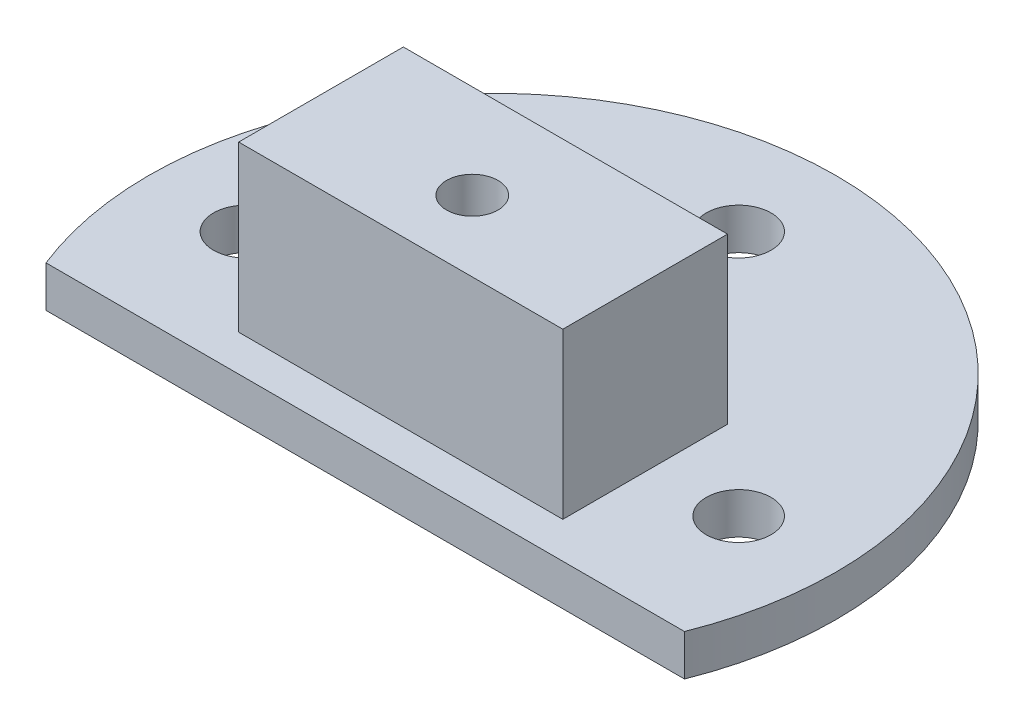
ISO-10303-21;
HEADER;
FILE_DESCRIPTION(('STEP AP214'),'2;1');
FILE_NAME('part.step','',(''),(''),'','','');
FILE_SCHEMA(('AUTOMOTIVE_DESIGN { 1 0 10303 214 1 1 1 1 }'));
ENDSEC;
DATA;
#1=APPLICATION_CONTEXT('core data for automotive mechanical design processes');
#2=APPLICATION_PROTOCOL_DEFINITION('international standard','automotive_design',2000,#1);
#3=PRODUCT_CONTEXT('',#1,'mechanical');
#4=PRODUCT('Part','Part','',(#3));
#5=PRODUCT_RELATED_PRODUCT_CATEGORY('part','',(#4));
#6=PRODUCT_DEFINITION_FORMATION('','',#4);
#7=PRODUCT_DEFINITION_CONTEXT('part definition',#1,'design');
#8=PRODUCT_DEFINITION('design','',#6,#7);
#9=PRODUCT_DEFINITION_SHAPE('','',#8);
#10=(LENGTH_UNIT() NAMED_UNIT(*) SI_UNIT(.MILLI.,.METRE.));
#11=(NAMED_UNIT(*) PLANE_ANGLE_UNIT() SI_UNIT($,.RADIAN.));
#12=(NAMED_UNIT(*) SI_UNIT($,.STERADIAN.) SOLID_ANGLE_UNIT());
#13=UNCERTAINTY_MEASURE_WITH_UNIT(LENGTH_MEASURE(1.E-05),#10,'distance_accuracy_value','');
#14=(GEOMETRIC_REPRESENTATION_CONTEXT(3) GLOBAL_UNCERTAINTY_ASSIGNED_CONTEXT((#13)) GLOBAL_UNIT_ASSIGNED_CONTEXT((#10,
#11,#12)) REPRESENTATION_CONTEXT('',''));
#15=CARTESIAN_POINT('',(0.,0.,0.));
#16=DIRECTION('',(0.,0.,1.));
#17=DIRECTION('',(1.,0.,0.));
#18=AXIS2_PLACEMENT_3D('',#15,#16,#17);
#19=CARTESIAN_POINT('',(0.,6.35,0.));
#20=DIRECTION('',(0.,1.,0.));
#21=DIRECTION('',(0.,0.,1.));
#22=AXIS2_PLACEMENT_3D('',#19,#20,#21);
#23=PLANE('',#22);
#24=DIRECTION('',(1.,0.,0.));
#25=VECTOR('',#24,1.);
#26=CARTESIAN_POINT('',(-25.1229174127317,6.35,-11.4));
#27=LINE('',#26,#25);
#28=CARTESIAN_POINT('',(-25.1229174127317,6.35,-11.4));
#29=VERTEX_POINT('',#28);
#30=CARTESIAN_POINT('',(24.8770825872683,6.35,-11.4));
#31=VERTEX_POINT('',#30);
#32=EDGE_CURVE('E122',#29,#31,#27,.T.);
#33=ORIENTED_EDGE('',*,*,#32,.T.);
#34=DIRECTION('',(0.,0.,-1.));
#35=VECTOR('',#34,1.);
#36=CARTESIAN_POINT('',(24.8770825872683,6.35,14.));
#37=LINE('',#36,#35);
#38=CARTESIAN_POINT('',(24.8770825872683,6.35,14.));
#39=VERTEX_POINT('',#38);
#40=EDGE_CURVE('E120',#39,#31,#37,.T.);
#41=ORIENTED_EDGE('',*,*,#40,.F.);
#42=DIRECTION('',(1.,0.,0.));
#43=VECTOR('',#42,1.);
#44=CARTESIAN_POINT('',(-25.1229174127317,6.35,14.));
#45=LINE('',#44,#43);
#46=CARTESIAN_POINT('',(-25.1229174127317,6.35,14.));
#47=VERTEX_POINT('',#46);
#48=EDGE_CURVE('E118',#47,#39,#45,.T.);
#49=ORIENTED_EDGE('',*,*,#48,.F.);
#50=DIRECTION('',(0.,0.,-1.));
#51=VECTOR('',#50,1.);
#52=CARTESIAN_POINT('',(-25.1229174127317,6.35,14.));
#53=LINE('',#52,#51);
#54=EDGE_CURVE('E114',#47,#29,#53,.T.);
#55=ORIENTED_EDGE('',*,*,#54,.T.);
#56=EDGE_LOOP('',(#33,#41,#49,#55));
#57=FACE_BOUND('',#56,.T.);
#58=CARTESIAN_POINT('',(38.,6.35,0.));
#59=DIRECTION('',(0.,1.,0.));
#60=DIRECTION('',(0.,0.,1.));
#61=AXIS2_PLACEMENT_3D('',#58,#59,#60);
#62=CIRCLE('',#61,5.);
#63=CARTESIAN_POINT('',(38.,6.35,5.));
#64=VERTEX_POINT('',#63);
#65=EDGE_CURVE('E90',#64,#64,#62,.T.);
#66=ORIENTED_EDGE('',*,*,#65,.F.);
#67=EDGE_LOOP('',(#66));
#68=FACE_BOUND('',#67,.T.);
#69=CARTESIAN_POINT('',(0.,6.35,0.));
#70=DIRECTION('',(0.,1.,0.));
#71=DIRECTION('',(0.,0.,1.));
#72=AXIS2_PLACEMENT_3D('',#69,#70,#71);
#73=CIRCLE('',#72,53.);
#74=CARTESIAN_POINT('',(49.2428543082641,6.35,19.5995229425382));
#75=VERTEX_POINT('',#74);
#76=CARTESIAN_POINT('',(-49.2428543082641,6.35,19.5995229425382));
#77=VERTEX_POINT('',#76);
#78=EDGE_CURVE('E75',#75,#77,#73,.T.);
#79=ORIENTED_EDGE('',*,*,#78,.T.);
#80=DIRECTION('',(1.,0.,0.));
#81=VECTOR('',#80,1.);
#82=CARTESIAN_POINT('',(-49.2428543082641,6.35,19.5995229425382));
#83=LINE('',#82,#81);
#84=EDGE_CURVE('E56',#77,#75,#83,.T.);
#85=ORIENTED_EDGE('',*,*,#84,.T.);
#86=EDGE_LOOP('',(#79,#85));
#87=FACE_BOUND('',#86,.T.);
#88=CARTESIAN_POINT('',(-38.,6.35,0.));
#89=DIRECTION('',(0.,1.,0.));
#90=DIRECTION('',(0.,0.,1.));
#91=AXIS2_PLACEMENT_3D('',#88,#89,#90);
#92=CIRCLE('',#91,5.);
#93=CARTESIAN_POINT('',(-38.,6.35,5.));
#94=VERTEX_POINT('',#93);
#95=EDGE_CURVE('E81',#94,#94,#92,.T.);
#96=ORIENTED_EDGE('',*,*,#95,.F.);
#97=EDGE_LOOP('',(#96));
#98=FACE_BOUND('',#97,.T.);
#99=CARTESIAN_POINT('',(0.,6.35,-38.));
#100=DIRECTION('',(0.,1.,0.));
#101=DIRECTION('',(0.,0.,1.));
#102=AXIS2_PLACEMENT_3D('',#99,#100,#101);
#103=CIRCLE('',#102,5.);
#104=CARTESIAN_POINT('',(0.,6.35,-33.));
#105=VERTEX_POINT('',#104);
#106=EDGE_CURVE('E95',#105,#105,#103,.T.);
#107=ORIENTED_EDGE('',*,*,#106,.F.);
#108=EDGE_LOOP('',(#107));
#109=FACE_BOUND('',#108,.T.);
#110=ADVANCED_FACE('F33',(#57,#68,#87,#98,#109),#23,.T.);
#111=CARTESIAN_POINT('',(0.,0.,0.));
#112=DIRECTION('',(0.,1.,0.));
#113=DIRECTION('',(0.,0.,1.));
#114=AXIS2_PLACEMENT_3D('',#111,#112,#113);
#115=PLANE('',#114);
#116=CARTESIAN_POINT('',(0.,0.,3.0894649210737));
#117=DIRECTION('',(0.,1.,0.));
#118=DIRECTION('',(0.,0.,1.));
#119=AXIS2_PLACEMENT_3D('',#116,#117,#118);
#120=CIRCLE('',#119,3.96875);
#121=CARTESIAN_POINT('',(0.,0.,7.0582149210737));
#122=VERTEX_POINT('',#121);
#123=EDGE_CURVE('E125',#122,#122,#120,.T.);
#124=ORIENTED_EDGE('',*,*,#123,.T.);
#125=EDGE_LOOP('',(#124));
#126=FACE_BOUND('',#125,.T.);
#127=CARTESIAN_POINT('',(0.,0.,0.));
#128=DIRECTION('',(0.,1.,0.));
#129=DIRECTION('',(0.,0.,1.));
#130=AXIS2_PLACEMENT_3D('',#127,#128,#129);
#131=CIRCLE('',#130,53.);
#132=CARTESIAN_POINT('',(49.2428543082641,0.,19.5995229425382));
#133=VERTEX_POINT('',#132);
#134=CARTESIAN_POINT('',(-49.2428543082641,0.,19.5995229425382));
#135=VERTEX_POINT('',#134);
#136=EDGE_CURVE('E76',#133,#135,#131,.T.);
#137=ORIENTED_EDGE('',*,*,#136,.F.);
#138=DIRECTION('',(1.,0.,0.));
#139=VECTOR('',#138,1.);
#140=CARTESIAN_POINT('',(-49.2428543082641,0.,19.5995229425382));
#141=LINE('',#140,#139);
#142=EDGE_CURVE('E67',#135,#133,#141,.T.);
#143=ORIENTED_EDGE('',*,*,#142,.F.);
#144=EDGE_LOOP('',(#137,#143));
#145=FACE_BOUND('',#144,.T.);
#146=CARTESIAN_POINT('',(-38.,0.,0.));
#147=DIRECTION('',(0.,1.,0.));
#148=DIRECTION('',(0.,0.,1.));
#149=AXIS2_PLACEMENT_3D('',#146,#147,#148);
#150=CIRCLE('',#149,5.);
#151=CARTESIAN_POINT('',(-38.,0.,5.));
#152=VERTEX_POINT('',#151);
#153=EDGE_CURVE('E84',#152,#152,#150,.T.);
#154=ORIENTED_EDGE('',*,*,#153,.T.);
#155=EDGE_LOOP('',(#154));
#156=FACE_BOUND('',#155,.T.);
#157=CARTESIAN_POINT('',(38.,0.,0.));
#158=DIRECTION('',(0.,1.,0.));
#159=DIRECTION('',(0.,0.,1.));
#160=AXIS2_PLACEMENT_3D('',#157,#158,#159);
#161=CIRCLE('',#160,5.);
#162=CARTESIAN_POINT('',(38.,0.,5.));
#163=VERTEX_POINT('',#162);
#164=EDGE_CURVE('E92',#163,#163,#161,.T.);
#165=ORIENTED_EDGE('',*,*,#164,.T.);
#166=EDGE_LOOP('',(#165));
#167=FACE_BOUND('',#166,.T.);
#168=CARTESIAN_POINT('',(0.,0.,-38.));
#169=DIRECTION('',(0.,1.,0.));
#170=DIRECTION('',(0.,0.,1.));
#171=AXIS2_PLACEMENT_3D('',#168,#169,#170);
#172=CIRCLE('',#171,5.);
#173=CARTESIAN_POINT('',(0.,0.,-33.));
#174=VERTEX_POINT('',#173);
#175=EDGE_CURVE('E98',#174,#174,#172,.T.);
#176=ORIENTED_EDGE('',*,*,#175,.T.);
#177=EDGE_LOOP('',(#176));
#178=FACE_BOUND('',#177,.T.);
#179=ADVANCED_FACE('F79',(#126,#145,#156,#167,#178),#115,.F.);
#180=CARTESIAN_POINT('',(0.,6.35,0.));
#181=DIRECTION('',(0.,-1.,0.));
#182=DIRECTION('',(0.,0.,-1.));
#183=AXIS2_PLACEMENT_3D('',#180,#181,#182);
#184=CYLINDRICAL_SURFACE('',#183,53.);
#185=ORIENTED_EDGE('',*,*,#136,.T.);
#186=DIRECTION('',(0.,-1.,0.));
#187=VECTOR('',#186,1.);
#188=CARTESIAN_POINT('',(-49.2428543082641,6.35,19.5995229425382));
#189=LINE('',#188,#187);
#190=EDGE_CURVE('E11',#77,#135,#189,.T.);
#191=ORIENTED_EDGE('',*,*,#190,.F.);
#192=ORIENTED_EDGE('',*,*,#78,.F.);
#193=DIRECTION('',(0.,-1.,0.));
#194=VECTOR('',#193,1.);
#195=CARTESIAN_POINT('',(49.2428543082641,6.35,19.5995229425382));
#196=LINE('',#195,#194);
#197=EDGE_CURVE('E41',#75,#133,#196,.T.);
#198=ORIENTED_EDGE('',*,*,#197,.T.);
#199=EDGE_LOOP('',(#185,#191,#192,#198));
#200=FACE_BOUND('',#199,.T.);
#201=ADVANCED_FACE('F35',(#200),#184,.T.);
#202=CARTESIAN_POINT('',(-49.2428543082641,6.35,19.5995229425382));
#203=DIRECTION('',(0.,0.,-1.));
#204=DIRECTION('',(-1.,0.,0.));
#205=AXIS2_PLACEMENT_3D('',#202,#203,#204);
#206=PLANE('',#205);
#207=ORIENTED_EDGE('',*,*,#142,.T.);
#208=ORIENTED_EDGE('',*,*,#197,.F.);
#209=ORIENTED_EDGE('',*,*,#84,.F.);
#210=ORIENTED_EDGE('',*,*,#190,.T.);
#211=EDGE_LOOP('',(#207,#208,#209,#210));
#212=FACE_BOUND('',#211,.T.);
#213=ADVANCED_FACE('F69',(#212),#206,.F.);
#214=CARTESIAN_POINT('',(-38.,6.35,0.));
#215=DIRECTION('',(0.,-1.,0.));
#216=DIRECTION('',(0.,0.,-1.));
#217=AXIS2_PLACEMENT_3D('',#214,#215,#216);
#218=CYLINDRICAL_SURFACE('',#217,5.);
#219=ORIENTED_EDGE('',*,*,#95,.T.);
#220=EDGE_LOOP('',(#219));
#221=FACE_BOUND('',#220,.T.);
#222=ORIENTED_EDGE('',*,*,#153,.F.);
#223=EDGE_LOOP('',(#222));
#224=FACE_BOUND('',#223,.T.);
#225=ADVANCED_FACE('F206',(#221,#224),#218,.F.);
#226=CARTESIAN_POINT('',(38.,6.35,0.));
#227=DIRECTION('',(0.,-1.,0.));
#228=DIRECTION('',(0.,0.,-1.));
#229=AXIS2_PLACEMENT_3D('',#226,#227,#228);
#230=CYLINDRICAL_SURFACE('',#229,5.);
#231=ORIENTED_EDGE('',*,*,#65,.T.);
#232=EDGE_LOOP('',(#231));
#233=FACE_BOUND('',#232,.T.);
#234=ORIENTED_EDGE('',*,*,#164,.F.);
#235=EDGE_LOOP('',(#234));
#236=FACE_BOUND('',#235,.T.);
#237=ADVANCED_FACE('F195',(#233,#236),#230,.F.);
#238=CARTESIAN_POINT('',(0.,6.35,-38.));
#239=DIRECTION('',(0.,-1.,0.));
#240=DIRECTION('',(0.,0.,-1.));
#241=AXIS2_PLACEMENT_3D('',#238,#239,#240);
#242=CYLINDRICAL_SURFACE('',#241,5.);
#243=ORIENTED_EDGE('',*,*,#106,.T.);
#244=EDGE_LOOP('',(#243));
#245=FACE_BOUND('',#244,.T.);
#246=ORIENTED_EDGE('',*,*,#175,.F.);
#247=EDGE_LOOP('',(#246));
#248=FACE_BOUND('',#247,.T.);
#249=ADVANCED_FACE('F192',(#245,#248),#242,.F.);
#250=CARTESIAN_POINT('',(-25.1229174127317,31.75,-11.4));
#251=DIRECTION('',(0.,0.,-1.));
#252=DIRECTION('',(-1.,0.,0.));
#253=AXIS2_PLACEMENT_3D('',#250,#251,#252);
#254=PLANE('',#253);
#255=ORIENTED_EDGE('',*,*,#32,.F.);
#256=DIRECTION('',(0.,-1.,0.));
#257=VECTOR('',#256,1.);
#258=CARTESIAN_POINT('',(-25.1229174127317,31.75,-11.4));
#259=LINE('',#258,#257);
#260=CARTESIAN_POINT('',(-25.1229174127317,31.75,-11.4));
#261=VERTEX_POINT('',#260);
#262=EDGE_CURVE('E101',#261,#29,#259,.T.);
#263=ORIENTED_EDGE('',*,*,#262,.F.);
#264=DIRECTION('',(1.,0.,0.));
#265=VECTOR('',#264,1.);
#266=CARTESIAN_POINT('',(-25.1229174127317,31.75,-11.4));
#267=LINE('',#266,#265);
#268=CARTESIAN_POINT('',(24.8770825872683,31.75,-11.4));
#269=VERTEX_POINT('',#268);
#270=EDGE_CURVE('E117',#261,#269,#267,.T.);
#271=ORIENTED_EDGE('',*,*,#270,.T.);
#272=DIRECTION('',(0.,-1.,0.));
#273=VECTOR('',#272,1.);
#274=CARTESIAN_POINT('',(24.8770825872683,31.75,-11.4));
#275=LINE('',#274,#273);
#276=EDGE_CURVE('E104',#269,#31,#275,.T.);
#277=ORIENTED_EDGE('',*,*,#276,.T.);
#278=EDGE_LOOP('',(#255,#263,#271,#277));
#279=FACE_BOUND('',#278,.T.);
#280=ADVANCED_FACE('F180',(#279),#254,.T.);
#281=CARTESIAN_POINT('',(-25.1229174127317,31.75,14.));
#282=DIRECTION('',(-1.,0.,0.));
#283=DIRECTION('',(0.,0.,1.));
#284=AXIS2_PLACEMENT_3D('',#281,#282,#283);
#285=PLANE('',#284);
#286=ORIENTED_EDGE('',*,*,#54,.F.);
#287=DIRECTION('',(0.,-1.,0.));
#288=VECTOR('',#287,1.);
#289=CARTESIAN_POINT('',(-25.1229174127317,31.75,14.));
#290=LINE('',#289,#288);
#291=CARTESIAN_POINT('',(-25.1229174127317,31.75,14.));
#292=VERTEX_POINT('',#291);
#293=EDGE_CURVE('E109',#292,#47,#290,.T.);
#294=ORIENTED_EDGE('',*,*,#293,.F.);
#295=DIRECTION('',(0.,0.,-1.));
#296=VECTOR('',#295,1.);
#297=CARTESIAN_POINT('',(-25.1229174127317,31.75,14.));
#298=LINE('',#297,#296);
#299=EDGE_CURVE('E107',#292,#261,#298,.T.);
#300=ORIENTED_EDGE('',*,*,#299,.T.);
#301=ORIENTED_EDGE('',*,*,#262,.T.);
#302=EDGE_LOOP('',(#286,#294,#300,#301));
#303=FACE_BOUND('',#302,.T.);
#304=ADVANCED_FACE('F165',(#303),#285,.T.);
#305=CARTESIAN_POINT('',(-25.1229174127317,31.75,14.));
#306=DIRECTION('',(0.,0.,-1.));
#307=DIRECTION('',(-1.,0.,0.));
#308=AXIS2_PLACEMENT_3D('',#305,#306,#307);
#309=PLANE('',#308);
#310=ORIENTED_EDGE('',*,*,#48,.T.);
#311=DIRECTION('',(0.,-1.,0.));
#312=VECTOR('',#311,1.);
#313=CARTESIAN_POINT('',(24.8770825872683,31.75,14.));
#314=LINE('',#313,#312);
#315=CARTESIAN_POINT('',(24.8770825872683,31.75,14.));
#316=VERTEX_POINT('',#315);
#317=EDGE_CURVE('E48',#316,#39,#314,.T.);
#318=ORIENTED_EDGE('',*,*,#317,.F.);
#319=DIRECTION('',(1.,0.,0.));
#320=VECTOR('',#319,1.);
#321=CARTESIAN_POINT('',(-25.1229174127317,31.75,14.));
#322=LINE('',#321,#320);
#323=EDGE_CURVE('E128',#292,#316,#322,.T.);
#324=ORIENTED_EDGE('',*,*,#323,.F.);
#325=ORIENTED_EDGE('',*,*,#293,.T.);
#326=EDGE_LOOP('',(#310,#318,#324,#325));
#327=FACE_BOUND('',#326,.T.);
#328=ADVANCED_FACE('F174',(#327),#309,.F.);
#329=CARTESIAN_POINT('',(24.8770825872683,31.75,14.));
#330=DIRECTION('',(-1.,0.,0.));
#331=DIRECTION('',(0.,0.,1.));
#332=AXIS2_PLACEMENT_3D('',#329,#330,#331);
#333=PLANE('',#332);
#334=ORIENTED_EDGE('',*,*,#40,.T.);
#335=ORIENTED_EDGE('',*,*,#276,.F.);
#336=DIRECTION('',(0.,0.,-1.));
#337=VECTOR('',#336,1.);
#338=CARTESIAN_POINT('',(24.8770825872683,31.75,14.));
#339=LINE('',#338,#337);
#340=EDGE_CURVE('E131',#316,#269,#339,.T.);
#341=ORIENTED_EDGE('',*,*,#340,.F.);
#342=ORIENTED_EDGE('',*,*,#317,.T.);
#343=EDGE_LOOP('',(#334,#335,#341,#342));
#344=FACE_BOUND('',#343,.T.);
#345=ADVANCED_FACE('F152',(#344),#333,.F.);
#346=CARTESIAN_POINT('',(0.,31.75,0.));
#347=DIRECTION('',(0.,1.,0.));
#348=DIRECTION('',(0.,0.,1.));
#349=AXIS2_PLACEMENT_3D('',#346,#347,#348);
#350=PLANE('',#349);
#351=CARTESIAN_POINT('',(0.,31.75,3.0894649210737));
#352=DIRECTION('',(0.,1.,0.));
#353=DIRECTION('',(0.,0.,1.));
#354=AXIS2_PLACEMENT_3D('',#351,#352,#353);
#355=CIRCLE('',#354,3.96875);
#356=CARTESIAN_POINT('',(0.,31.75,7.0582149210737));
#357=VERTEX_POINT('',#356);
#358=EDGE_CURVE('E136',#357,#357,#355,.T.);
#359=ORIENTED_EDGE('',*,*,#358,.F.);
#360=EDGE_LOOP('',(#359));
#361=FACE_BOUND('',#360,.T.);
#362=ORIENTED_EDGE('',*,*,#270,.F.);
#363=ORIENTED_EDGE('',*,*,#299,.F.);
#364=ORIENTED_EDGE('',*,*,#323,.T.);
#365=ORIENTED_EDGE('',*,*,#340,.T.);
#366=EDGE_LOOP('',(#362,#363,#364,#365));
#367=FACE_BOUND('',#366,.T.);
#368=ADVANCED_FACE('F146',(#361,#367),#350,.T.);
#369=CARTESIAN_POINT('',(0.,0.,3.0894649210737));
#370=DIRECTION('',(0.,1.,0.));
#371=DIRECTION('',(0.,0.,1.));
#372=AXIS2_PLACEMENT_3D('',#369,#370,#371);
#373=CYLINDRICAL_SURFACE('',#372,3.96875);
#374=ORIENTED_EDGE('',*,*,#123,.F.);
#375=EDGE_LOOP('',(#374));
#376=FACE_BOUND('',#375,.T.);
#377=ORIENTED_EDGE('',*,*,#358,.T.);
#378=EDGE_LOOP('',(#377));
#379=FACE_BOUND('',#378,.T.);
#380=ADVANCED_FACE('F143',(#376,#379),#373,.F.);
#381=CLOSED_SHELL('',(#110,#179,#201,#213,#225,#237,#249,#280,#304,#328,#345,#368,#380));
#382=MANIFOLD_SOLID_BREP('B2',#381);
#383=ADVANCED_BREP_SHAPE_REPRESENTATION('',(#18,#382),#14);
#384=SHAPE_DEFINITION_REPRESENTATION(#9,#383);
ENDSEC;
END-ISO-10303-21;
